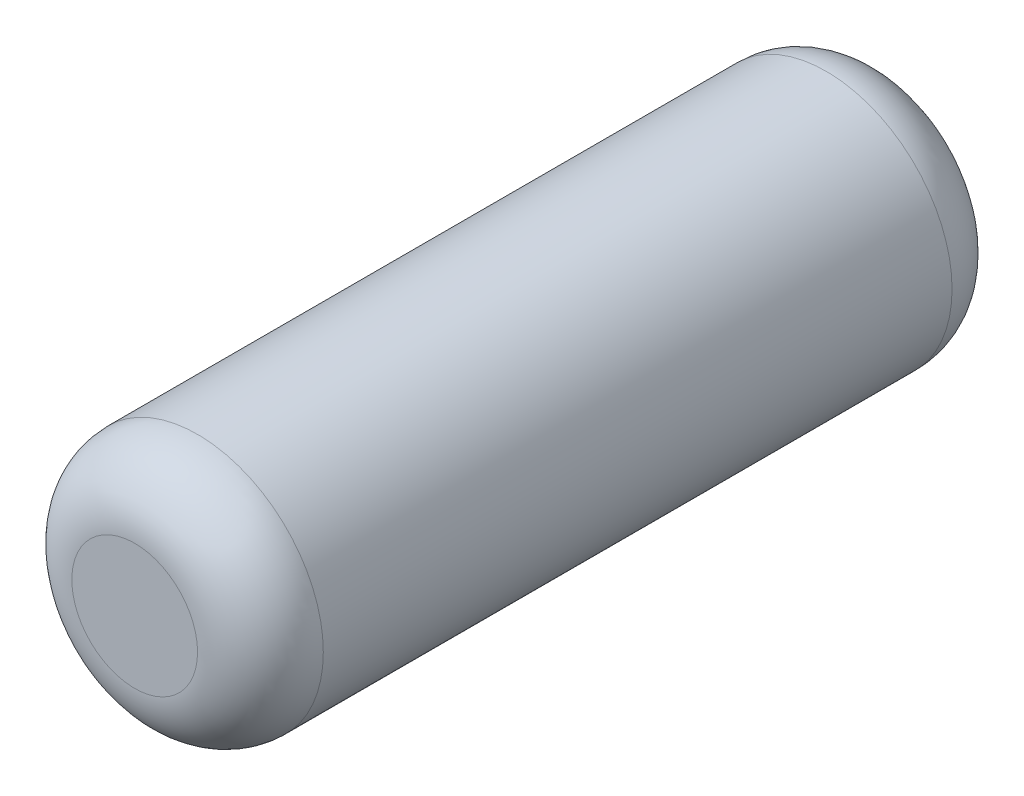
ISO-10303-21;
HEADER;
FILE_DESCRIPTION(('STEP AP214'),'2;1');
FILE_NAME('part.step','',(''),(''),'','','');
FILE_SCHEMA(('AUTOMOTIVE_DESIGN { 1 0 10303 214 1 1 1 1 }'));
ENDSEC;
DATA;
#1=APPLICATION_CONTEXT('core data for automotive mechanical design processes');
#2=APPLICATION_PROTOCOL_DEFINITION('international standard','automotive_design',2000,#1);
#3=PRODUCT_CONTEXT('',#1,'mechanical');
#4=PRODUCT('Part','Part','',(#3));
#5=PRODUCT_RELATED_PRODUCT_CATEGORY('part','',(#4));
#6=PRODUCT_DEFINITION_FORMATION('','',#4);
#7=PRODUCT_DEFINITION_CONTEXT('part definition',#1,'design');
#8=PRODUCT_DEFINITION('design','',#6,#7);
#9=PRODUCT_DEFINITION_SHAPE('','',#8);
#10=(LENGTH_UNIT() NAMED_UNIT(*) SI_UNIT(.MILLI.,.METRE.));
#11=(NAMED_UNIT(*) PLANE_ANGLE_UNIT() SI_UNIT($,.RADIAN.));
#12=(NAMED_UNIT(*) SI_UNIT($,.STERADIAN.) SOLID_ANGLE_UNIT());
#13=UNCERTAINTY_MEASURE_WITH_UNIT(LENGTH_MEASURE(1.E-05),#10,'distance_accuracy_value','');
#14=(GEOMETRIC_REPRESENTATION_CONTEXT(3) GLOBAL_UNCERTAINTY_ASSIGNED_CONTEXT((#13)) GLOBAL_UNIT_ASSIGNED_CONTEXT((#10,
#11,#12)) REPRESENTATION_CONTEXT('',''));
#15=CARTESIAN_POINT('',(0.,0.,0.));
#16=DIRECTION('',(0.,0.,1.));
#17=DIRECTION('',(1.,0.,0.));
#18=AXIS2_PLACEMENT_3D('',#15,#16,#17);
#19=CARTESIAN_POINT('',(0.,0.,150.));
#20=DIRECTION('',(0.,0.,-1.));
#21=DIRECTION('',(-1.,0.,0.));
#22=AXIS2_PLACEMENT_3D('',#19,#20,#21);
#23=CYLINDRICAL_SURFACE('',#22,50.);
#24=CARTESIAN_POINT('',(0.,0.,-125.));
#25=DIRECTION('',(0.,0.,1.));
#26=DIRECTION('',(1.,0.,0.));
#27=AXIS2_PLACEMENT_3D('',#24,#25,#26);
#28=CIRCLE('',#27,50.);
#29=CARTESIAN_POINT('',(50.,0.,-125.));
#30=VERTEX_POINT('',#29);
#31=EDGE_CURVE('E49',#30,#30,#28,.T.);
#32=ORIENTED_EDGE('',*,*,#31,.T.);
#33=EDGE_LOOP('',(#32));
#34=FACE_BOUND('',#33,.T.);
#35=CARTESIAN_POINT('',(0.,0.,125.));
#36=DIRECTION('',(0.,0.,1.));
#37=DIRECTION('',(1.,0.,0.));
#38=AXIS2_PLACEMENT_3D('',#35,#36,#37);
#39=CIRCLE('',#38,50.);
#40=CARTESIAN_POINT('',(50.,0.,125.));
#41=VERTEX_POINT('',#40);
#42=EDGE_CURVE('E54',#41,#41,#39,.F.);
#43=ORIENTED_EDGE('',*,*,#42,.T.);
#44=EDGE_LOOP('',(#43));
#45=FACE_BOUND('',#44,.T.);
#46=ADVANCED_FACE('F36',(#34,#45),#23,.T.);
#47=CARTESIAN_POINT('',(0.,0.,150.));
#48=DIRECTION('',(0.,0.,1.));
#49=DIRECTION('',(1.,0.,0.));
#50=AXIS2_PLACEMENT_3D('',#47,#48,#49);
#51=PLANE('',#50);
#52=CARTESIAN_POINT('',(0.,0.,150.));
#53=DIRECTION('',(0.,0.,1.));
#54=DIRECTION('',(1.,0.,0.));
#55=AXIS2_PLACEMENT_3D('',#52,#53,#54);
#56=CIRCLE('',#55,25.);
#57=CARTESIAN_POINT('',(25.,0.,150.));
#58=VERTEX_POINT('',#57);
#59=EDGE_CURVE('E10',#58,#58,#56,.T.);
#60=ORIENTED_EDGE('',*,*,#59,.T.);
#61=EDGE_LOOP('',(#60));
#62=FACE_BOUND('',#61,.T.);
#63=ADVANCED_FACE('F71',(#62),#51,.T.);
#64=CARTESIAN_POINT('',(0.,0.,-150.));
#65=DIRECTION('',(0.,0.,1.));
#66=DIRECTION('',(1.,0.,0.));
#67=AXIS2_PLACEMENT_3D('',#64,#65,#66);
#68=PLANE('',#67);
#69=CARTESIAN_POINT('',(0.,0.,-150.));
#70=DIRECTION('',(0.,0.,1.));
#71=DIRECTION('',(1.,0.,0.));
#72=AXIS2_PLACEMENT_3D('',#69,#70,#71);
#73=CIRCLE('',#72,25.);
#74=CARTESIAN_POINT('',(25.,0.,-150.));
#75=VERTEX_POINT('',#74);
#76=EDGE_CURVE('E44',#75,#75,#73,.F.);
#77=ORIENTED_EDGE('',*,*,#76,.T.);
#78=EDGE_LOOP('',(#77));
#79=FACE_BOUND('',#78,.T.);
#80=ADVANCED_FACE('F68',(#79),#68,.F.);
#81=CARTESIAN_POINT('',(0.,0.,-125.));
#82=DIRECTION('',(0.,0.,1.));
#83=DIRECTION('',(1.,0.,0.));
#84=AXIS2_PLACEMENT_3D('',#81,#82,#83);
#85=DEGENERATE_TOROIDAL_SURFACE('',#84,25.,25.,.T.);
#86=ORIENTED_EDGE('',*,*,#76,.F.);
#87=EDGE_LOOP('',(#86));
#88=FACE_BOUND('',#87,.T.);
#89=ORIENTED_EDGE('',*,*,#31,.F.);
#90=EDGE_LOOP('',(#89));
#91=FACE_BOUND('',#90,.T.);
#92=ADVANCED_FACE('F64',(#88,#91),#85,.T.);
#93=CARTESIAN_POINT('',(0.,0.,125.));
#94=DIRECTION('',(0.,0.,1.));
#95=DIRECTION('',(1.,0.,0.));
#96=AXIS2_PLACEMENT_3D('',#93,#94,#95);
#97=DEGENERATE_TOROIDAL_SURFACE('',#96,25.,25.,.T.);
#98=ORIENTED_EDGE('',*,*,#42,.F.);
#99=EDGE_LOOP('',(#98));
#100=FACE_BOUND('',#99,.T.);
#101=ORIENTED_EDGE('',*,*,#59,.F.);
#102=EDGE_LOOP('',(#101));
#103=FACE_BOUND('',#102,.T.);
#104=ADVANCED_FACE('F38',(#100,#103),#97,.T.);
#105=CLOSED_SHELL('',(#46,#63,#80,#92,#104));
#106=MANIFOLD_SOLID_BREP('B2',#105);
#107=ADVANCED_BREP_SHAPE_REPRESENTATION('',(#18,#106),#14);
#108=SHAPE_DEFINITION_REPRESENTATION(#9,#107);
ENDSEC;
END-ISO-10303-21;
